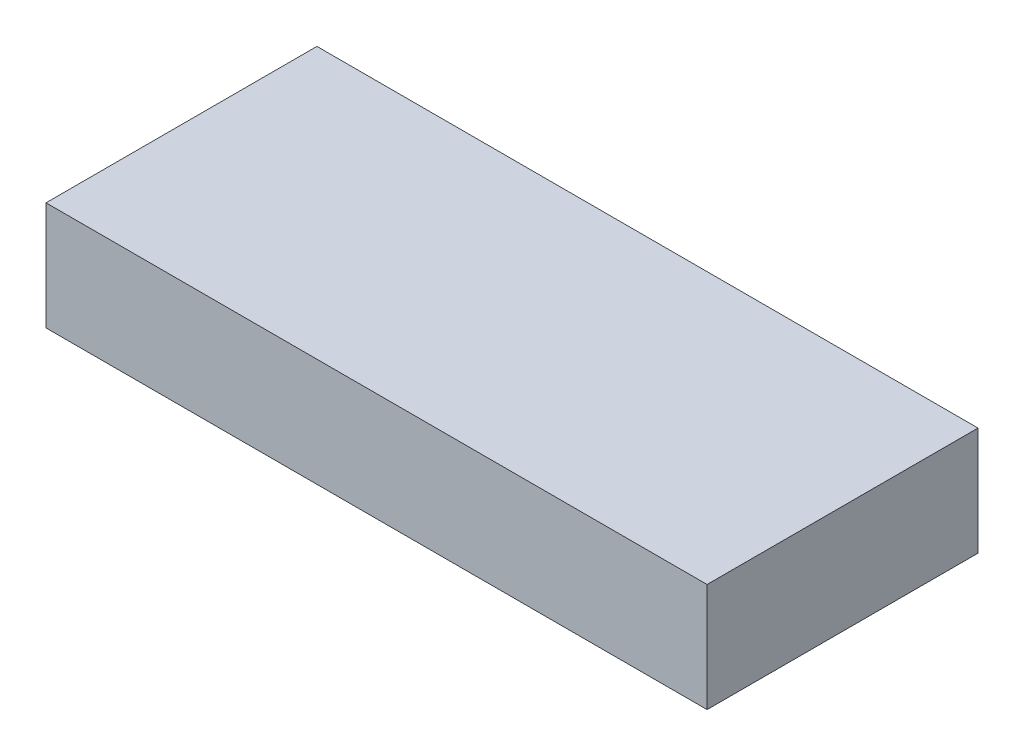
ISO-10303-21;
HEADER;
FILE_DESCRIPTION(('STEP AP214'),'2;1');
FILE_NAME('part.step','',(''),(''),'','','');
FILE_SCHEMA(('AUTOMOTIVE_DESIGN { 1 0 10303 214 1 1 1 1 }'));
ENDSEC;
DATA;
#1=APPLICATION_CONTEXT('core data for automotive mechanical design processes');
#2=APPLICATION_PROTOCOL_DEFINITION('international standard','automotive_design',2000,#1);
#3=PRODUCT_CONTEXT('',#1,'mechanical');
#4=PRODUCT('Part','Part','',(#3));
#5=PRODUCT_RELATED_PRODUCT_CATEGORY('part','',(#4));
#6=PRODUCT_DEFINITION_FORMATION('','',#4);
#7=PRODUCT_DEFINITION_CONTEXT('part definition',#1,'design');
#8=PRODUCT_DEFINITION('design','',#6,#7);
#9=PRODUCT_DEFINITION_SHAPE('','',#8);
#10=(LENGTH_UNIT() NAMED_UNIT(*) SI_UNIT(.MILLI.,.METRE.));
#11=(NAMED_UNIT(*) PLANE_ANGLE_UNIT() SI_UNIT($,.RADIAN.));
#12=(NAMED_UNIT(*) SI_UNIT($,.STERADIAN.) SOLID_ANGLE_UNIT());
#13=UNCERTAINTY_MEASURE_WITH_UNIT(LENGTH_MEASURE(1.E-05),#10,'distance_accuracy_value','');
#14=(GEOMETRIC_REPRESENTATION_CONTEXT(3) GLOBAL_UNCERTAINTY_ASSIGNED_CONTEXT((#13)) GLOBAL_UNIT_ASSIGNED_CONTEXT((#10,
#11,#12)) REPRESENTATION_CONTEXT('',''));
#15=CARTESIAN_POINT('',(0.,0.,0.));
#16=DIRECTION('',(0.,0.,1.));
#17=DIRECTION('',(1.,0.,0.));
#18=AXIS2_PLACEMENT_3D('',#15,#16,#17);
#19=CARTESIAN_POINT('',(30.5,10.,12.5));
#20=DIRECTION('',(-1.,0.,0.));
#21=DIRECTION('',(0.,0.,1.));
#22=AXIS2_PLACEMENT_3D('',#19,#20,#21);
#23=PLANE('',#22);
#24=DIRECTION('',(0.,0.,-1.));
#25=VECTOR('',#24,1.);
#26=CARTESIAN_POINT('',(30.5,0.,12.5));
#27=LINE('',#26,#25);
#28=CARTESIAN_POINT('',(30.5,0.,12.5));
#29=VERTEX_POINT('',#28);
#30=CARTESIAN_POINT('',(30.5,0.,-12.5));
#31=VERTEX_POINT('',#30);
#32=EDGE_CURVE('E105',#29,#31,#27,.T.);
#33=ORIENTED_EDGE('',*,*,#32,.T.);
#34=DIRECTION('',(0.,-1.,0.));
#35=VECTOR('',#34,1.);
#36=CARTESIAN_POINT('',(30.5,10.,-12.5));
#37=LINE('',#36,#35);
#38=CARTESIAN_POINT('',(30.5,10.,-12.5));
#39=VERTEX_POINT('',#38);
#40=EDGE_CURVE('E11',#39,#31,#37,.T.);
#41=ORIENTED_EDGE('',*,*,#40,.F.);
#42=DIRECTION('',(0.,0.,-1.));
#43=VECTOR('',#42,1.);
#44=CARTESIAN_POINT('',(30.5,10.,12.5));
#45=LINE('',#44,#43);
#46=CARTESIAN_POINT('',(30.5,10.,12.5));
#47=VERTEX_POINT('',#46);
#48=EDGE_CURVE('E89',#47,#39,#45,.T.);
#49=ORIENTED_EDGE('',*,*,#48,.F.);
#50=DIRECTION('',(0.,-1.,0.));
#51=VECTOR('',#50,1.);
#52=CARTESIAN_POINT('',(30.5,10.,12.5));
#53=LINE('',#52,#51);
#54=EDGE_CURVE('E97',#47,#29,#53,.T.);
#55=ORIENTED_EDGE('',*,*,#54,.T.);
#56=EDGE_LOOP('',(#33,#41,#49,#55));
#57=FACE_BOUND('',#56,.T.);
#58=ADVANCED_FACE('F39',(#57),#23,.F.);
#59=CARTESIAN_POINT('',(-30.5,10.,-12.5));
#60=DIRECTION('',(0.,0.,1.));
#61=DIRECTION('',(1.,0.,0.));
#62=AXIS2_PLACEMENT_3D('',#59,#60,#61);
#63=PLANE('',#62);
#64=DIRECTION('',(-1.,0.,0.));
#65=VECTOR('',#64,1.);
#66=CARTESIAN_POINT('',(-30.5,0.,-12.5));
#67=LINE('',#66,#65);
#68=CARTESIAN_POINT('',(-30.5,0.,-12.5));
#69=VERTEX_POINT('',#68);
#70=EDGE_CURVE('E92',#31,#69,#67,.T.);
#71=ORIENTED_EDGE('',*,*,#70,.T.);
#72=DIRECTION('',(0.,-1.,0.));
#73=VECTOR('',#72,1.);
#74=CARTESIAN_POINT('',(-30.5,10.,-12.5));
#75=LINE('',#74,#73);
#76=CARTESIAN_POINT('',(-30.5,10.,-12.5));
#77=VERTEX_POINT('',#76);
#78=EDGE_CURVE('E50',#77,#69,#75,.T.);
#79=ORIENTED_EDGE('',*,*,#78,.F.);
#80=DIRECTION('',(-1.,0.,0.));
#81=VECTOR('',#80,1.);
#82=CARTESIAN_POINT('',(-30.5,10.,-12.5));
#83=LINE('',#82,#81);
#84=EDGE_CURVE('E82',#39,#77,#83,.T.);
#85=ORIENTED_EDGE('',*,*,#84,.F.);
#86=ORIENTED_EDGE('',*,*,#40,.T.);
#87=EDGE_LOOP('',(#71,#79,#85,#86));
#88=FACE_BOUND('',#87,.T.);
#89=ADVANCED_FACE('F93',(#88),#63,.F.);
#90=CARTESIAN_POINT('',(-30.5,10.,12.5));
#91=DIRECTION('',(1.,0.,0.));
#92=DIRECTION('',(0.,0.,-1.));
#93=AXIS2_PLACEMENT_3D('',#90,#91,#92);
#94=PLANE('',#93);
#95=DIRECTION('',(0.,0.,1.));
#96=VECTOR('',#95,1.);
#97=CARTESIAN_POINT('',(-30.5,0.,12.5));
#98=LINE('',#97,#96);
#99=CARTESIAN_POINT('',(-30.5,0.,12.5));
#100=VERTEX_POINT('',#99);
#101=EDGE_CURVE('E72',#69,#100,#98,.T.);
#102=ORIENTED_EDGE('',*,*,#101,.T.);
#103=DIRECTION('',(0.,-1.,0.));
#104=VECTOR('',#103,1.);
#105=CARTESIAN_POINT('',(-30.5,10.,12.5));
#106=LINE('',#105,#104);
#107=CARTESIAN_POINT('',(-30.5,10.,12.5));
#108=VERTEX_POINT('',#107);
#109=EDGE_CURVE('E94',#108,#100,#106,.T.);
#110=ORIENTED_EDGE('',*,*,#109,.F.);
#111=DIRECTION('',(0.,0.,1.));
#112=VECTOR('',#111,1.);
#113=CARTESIAN_POINT('',(-30.5,10.,12.5));
#114=LINE('',#113,#112);
#115=EDGE_CURVE('E88',#77,#108,#114,.T.);
#116=ORIENTED_EDGE('',*,*,#115,.F.);
#117=ORIENTED_EDGE('',*,*,#78,.T.);
#118=EDGE_LOOP('',(#102,#110,#116,#117));
#119=FACE_BOUND('',#118,.T.);
#120=ADVANCED_FACE('F96',(#119),#94,.F.);
#121=CARTESIAN_POINT('',(-30.5,10.,12.5));
#122=DIRECTION('',(0.,0.,-1.));
#123=DIRECTION('',(-1.,0.,0.));
#124=AXIS2_PLACEMENT_3D('',#121,#122,#123);
#125=PLANE('',#124);
#126=DIRECTION('',(1.,0.,0.));
#127=VECTOR('',#126,1.);
#128=CARTESIAN_POINT('',(-30.5,0.,12.5));
#129=LINE('',#128,#127);
#130=EDGE_CURVE('E76',#100,#29,#129,.T.);
#131=ORIENTED_EDGE('',*,*,#130,.T.);
#132=ORIENTED_EDGE('',*,*,#54,.F.);
#133=DIRECTION('',(1.,0.,0.));
#134=VECTOR('',#133,1.);
#135=CARTESIAN_POINT('',(-30.5,10.,12.5));
#136=LINE('',#135,#134);
#137=EDGE_CURVE('E54',#108,#47,#136,.T.);
#138=ORIENTED_EDGE('',*,*,#137,.F.);
#139=ORIENTED_EDGE('',*,*,#109,.T.);
#140=EDGE_LOOP('',(#131,#132,#138,#139));
#141=FACE_BOUND('',#140,.T.);
#142=ADVANCED_FACE('F108',(#141),#125,.F.);
#143=CARTESIAN_POINT('',(0.,10.,0.));
#144=DIRECTION('',(0.,-1.,0.));
#145=DIRECTION('',(0.,0.,-1.));
#146=AXIS2_PLACEMENT_3D('',#143,#144,#145);
#147=PLANE('',#146);
#148=ORIENTED_EDGE('',*,*,#48,.T.);
#149=ORIENTED_EDGE('',*,*,#84,.T.);
#150=ORIENTED_EDGE('',*,*,#115,.T.);
#151=ORIENTED_EDGE('',*,*,#137,.T.);
#152=EDGE_LOOP('',(#148,#149,#150,#151));
#153=FACE_BOUND('',#152,.T.);
#154=ADVANCED_FACE('F86',(#153),#147,.F.);
#155=CARTESIAN_POINT('',(0.,0.,0.));
#156=DIRECTION('',(0.,-1.,0.));
#157=DIRECTION('',(0.,0.,-1.));
#158=AXIS2_PLACEMENT_3D('',#155,#156,#157);
#159=PLANE('',#158);
#160=ORIENTED_EDGE('',*,*,#32,.F.);
#161=ORIENTED_EDGE('',*,*,#130,.F.);
#162=ORIENTED_EDGE('',*,*,#101,.F.);
#163=ORIENTED_EDGE('',*,*,#70,.F.);
#164=EDGE_LOOP('',(#160,#161,#162,#163));
#165=FACE_BOUND('',#164,.T.);
#166=ADVANCED_FACE('F115',(#165),#159,.T.);
#167=CLOSED_SHELL('',(#58,#89,#120,#142,#154,#166));
#168=MANIFOLD_SOLID_BREP('B2',#167);
#169=ADVANCED_BREP_SHAPE_REPRESENTATION('',(#18,#168),#14);
#170=SHAPE_DEFINITION_REPRESENTATION(#9,#169);
ENDSEC;
END-ISO-10303-21;
